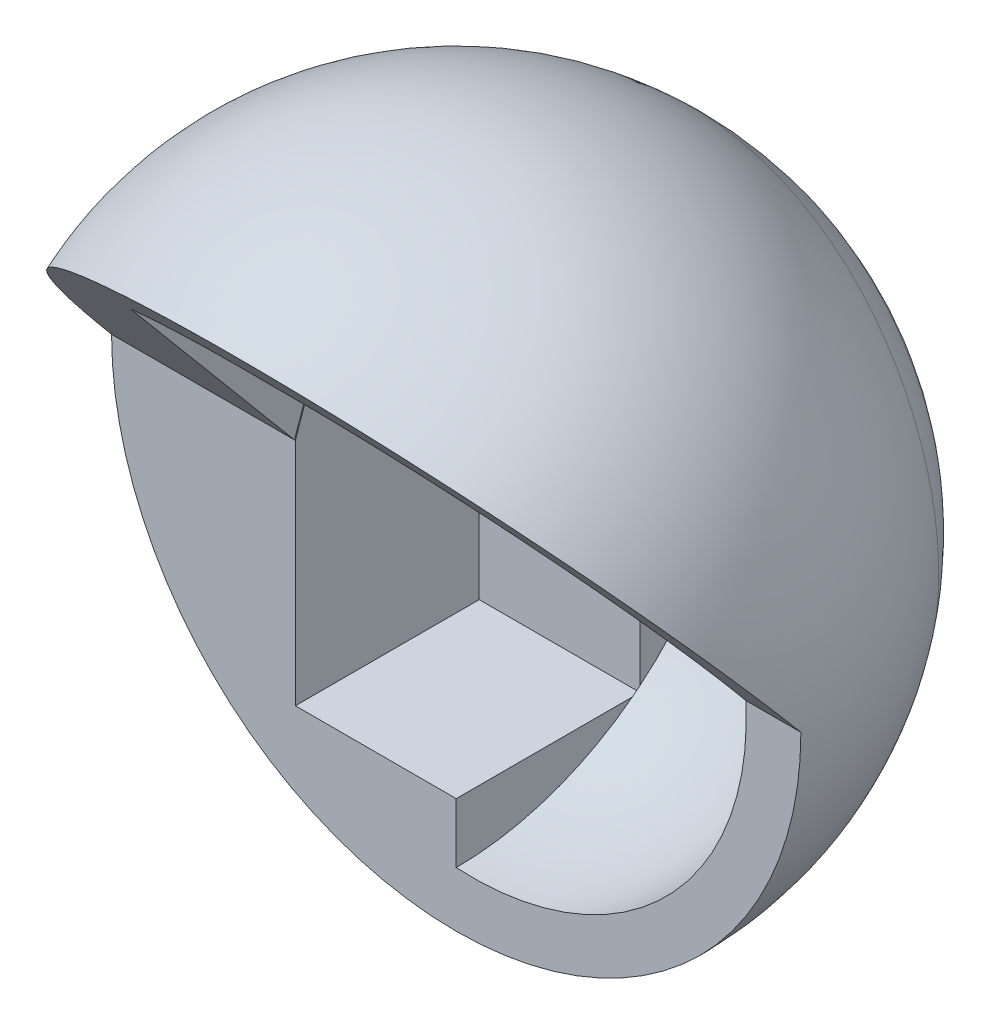
ISO-10303-21;
HEADER;
FILE_DESCRIPTION(('STEP AP214'),'2;1');
FILE_NAME('part.step','',(''),(''),'','','');
FILE_SCHEMA(('AUTOMOTIVE_DESIGN { 1 0 10303 214 1 1 1 1 }'));
ENDSEC;
DATA;
#1=APPLICATION_CONTEXT('core data for automotive mechanical design processes');
#2=APPLICATION_PROTOCOL_DEFINITION('international standard','automotive_design',2000,#1);
#3=PRODUCT_CONTEXT('',#1,'mechanical');
#4=PRODUCT('Part','Part','',(#3));
#5=PRODUCT_RELATED_PRODUCT_CATEGORY('part','',(#4));
#6=PRODUCT_DEFINITION_FORMATION('','',#4);
#7=PRODUCT_DEFINITION_CONTEXT('part definition',#1,'design');
#8=PRODUCT_DEFINITION('design','',#6,#7);
#9=PRODUCT_DEFINITION_SHAPE('','',#8);
#10=(LENGTH_UNIT() NAMED_UNIT(*) SI_UNIT(.MILLI.,.METRE.));
#11=(NAMED_UNIT(*) PLANE_ANGLE_UNIT() SI_UNIT($,.RADIAN.));
#12=(NAMED_UNIT(*) SI_UNIT($,.STERADIAN.) SOLID_ANGLE_UNIT());
#13=UNCERTAINTY_MEASURE_WITH_UNIT(LENGTH_MEASURE(1.E-05),#10,'distance_accuracy_value','');
#14=(GEOMETRIC_REPRESENTATION_CONTEXT(3) GLOBAL_UNCERTAINTY_ASSIGNED_CONTEXT((#13)) GLOBAL_UNIT_ASSIGNED_CONTEXT((#10,
#11,#12)) REPRESENTATION_CONTEXT('',''));
#15=CARTESIAN_POINT('',(0.,0.,0.));
#16=DIRECTION('',(0.,0.,1.));
#17=DIRECTION('',(1.,0.,0.));
#18=AXIS2_PLACEMENT_3D('',#15,#16,#17);
#19=CARTESIAN_POINT('',(0.,0.,0.));
#20=DIRECTION('',(-1.,0.,0.));
#21=DIRECTION('',(0.,-0.766044443118975,-0.642787609686545));
#22=AXIS2_PLACEMENT_3D('',#19,#20,#21);
#23=SPHERICAL_SURFACE('',#22,19.05);
#24=CARTESIAN_POINT('',(0.,0.,0.));
#25=DIRECTION('',(0.,0.642787609686547,-0.766044443118972));
#26=DIRECTION('',(1.,0.,0.));
#27=AXIS2_PLACEMENT_3D('',#24,#25,#26);
#28=CIRCLE('',#27,19.05);
#29=CARTESIAN_POINT('',(-19.05,0.,0.));
#30=VERTEX_POINT('',#29);
#31=CARTESIAN_POINT('',(19.0500000000001,0.,0.));
#32=VERTEX_POINT('',#31);
#33=EDGE_CURVE('E177',#30,#32,#28,.T.);
#34=ORIENTED_EDGE('',*,*,#33,.T.);
#35=CARTESIAN_POINT('',(0.,0.,0.));
#36=DIRECTION('',(0.,0.,0.999999999999999));
#37=DIRECTION('',(1.,0.,0.));
#38=AXIS2_PLACEMENT_3D('',#35,#36,#37);
#39=CIRCLE('',#38,19.05);
#40=EDGE_CURVE('E71',#30,#32,#39,.T.);
#41=ORIENTED_EDGE('',*,*,#40,.F.);
#42=EDGE_LOOP('',(#34,#41));
#43=FACE_BOUND('',#42,.T.);
#44=CARTESIAN_POINT('',(15.24,0.,-11.43));
#45=CARTESIAN_POINT('',(15.2400009823369,-0.178063826043721,-11.4299995298907));
#46=CARTESIAN_POINT('',(15.2362852653501,-0.356110612962425,-11.4307914957965));
#47=CARTESIAN_POINT('',(15.2214389171233,-0.711889701182731,-11.4339502030247));
#48=CARTESIAN_POINT('',(15.2103078202287,-0.889621982031875,-11.4363170432424));
#49=CARTESIAN_POINT('',(15.1662735878653,-1.41648921489206,-11.4456606275985));
#50=CARTESIAN_POINT('',(15.1227249297518,-1.76475595476199,-11.4548820073294));
#51=CARTESIAN_POINT('',(15.0073648564424,-2.45669954586842,-11.479088498572));
#52=CARTESIAN_POINT('',(14.9355234635593,-2.80037112762853,-11.4940797231636));
#53=CARTESIAN_POINT('',(14.7633034251424,-3.4846542732724,-11.5295636647649));
#54=CARTESIAN_POINT('',(14.6625888106055,-3.82517798952523,-11.5501209824876));
#55=CARTESIAN_POINT('',(14.4339890068772,-4.49680039201005,-11.5960198444238));
#56=CARTESIAN_POINT('',(14.3060916084978,-4.82789476700762,-11.6213635378732));
#57=CARTESIAN_POINT('',(14.0243586520837,-5.47863449923014,-11.6760835868837));
#58=CARTESIAN_POINT('',(13.8705141429511,-5.79827585915945,-11.7054613334391));
#59=CARTESIAN_POINT('',(13.5383894050791,-6.42410546764449,-11.7674038732233));
#60=CARTESIAN_POINT('',(13.3601181799638,-6.73029861851343,-11.7999674908893));
#61=CARTESIAN_POINT('',(12.9741946824925,-7.33790772737197,-11.868570274901));
#62=CARTESIAN_POINT('',(12.7657537276571,-7.6388134850875,-11.9046896589006));
#63=CARTESIAN_POINT('',(12.3263207118826,-8.22291593302925,-11.9784286539699));
#64=CARTESIAN_POINT('',(12.0953547359424,-8.50613249877752,-12.0160465005647));
#65=CARTESIAN_POINT('',(11.6124905851728,-9.05392019712117,-12.0918903574871));
#66=CARTESIAN_POINT('',(11.3605963077393,-9.31849478445508,-12.1301162535126));
#67=CARTESIAN_POINT('',(10.8373942729328,-9.82820375081322,-12.2063409556836));
#68=CARTESIAN_POINT('',(10.5660693447772,-10.0733205215544,-12.2443395280027));
#69=CARTESIAN_POINT('',(10.0033110780108,-10.5451803525052,-12.3196182782747));
#70=CARTESIAN_POINT('',(9.71170997024378,-10.7717248474113,-12.3568880835511));
#71=CARTESIAN_POINT('',(9.11247712461838,-11.2030596302656,-12.4295765170776));
#72=CARTESIAN_POINT('',(8.80483977802566,-11.4078422297787,-12.4649944888484));
#73=CARTESIAN_POINT('',(8.17541000621675,-11.7949000035578,-12.5332828541712));
#74=CARTESIAN_POINT('',(7.85361613128532,-11.977172865378,-12.5661529858523));
#75=CARTESIAN_POINT('',(7.19769453470059,-12.3186175387298,-12.6287396688006));
#76=CARTESIAN_POINT('',(6.86356599783701,-12.4777878199474,-12.6584560111259));
#77=CARTESIAN_POINT('',(6.13271408442844,-12.7951362452119,-12.7184870131802));
#78=CARTESIAN_POINT('',(5.73424548336606,-12.9494238430734,-12.7481954091645));
#79=CARTESIAN_POINT('',(4.92633051876324,-13.2259044533324,-12.8020356651709));
#80=CARTESIAN_POINT('',(4.51689293408801,-13.3481223336328,-12.8261718443156));
#81=CARTESIAN_POINT('',(3.68933910641374,-13.5601925264528,-12.8683868615838));
#82=CARTESIAN_POINT('',(3.27122135142691,-13.6500391493777,-12.8864646348388));
#83=CARTESIAN_POINT('',(2.42897149108955,-13.7970213071646,-12.9161839474554));
#84=CARTESIAN_POINT('',(2.00483824037518,-13.8541505244962,-12.9278242437649));
#85=CARTESIAN_POINT('',(1.15335913799094,-13.9354607073557,-12.9444253087144));
#86=CARTESIAN_POINT('',(0.726013758307721,-13.9596464219481,-12.9493870401207));
#87=CARTESIAN_POINT('',(-0.129294355563367,-13.9749987143737,-12.9525342605061));
#88=CARTESIAN_POINT('',(-0.557257090047398,-13.9661652763615,-12.9507197462333));
#89=CARTESIAN_POINT('',(-1.41114947893938,-13.915510412197,-12.9403508453284));
#90=CARTESIAN_POINT('',(-1.83707911280677,-13.8736886534684,-12.9317963907466));
#91=CARTESIAN_POINT('',(-2.68424729188399,-13.7572055031299,-12.9081203205957));
#92=CARTESIAN_POINT('',(-3.10548578684625,-13.6825437601118,-12.8929986347531));
#93=CARTESIAN_POINT('',(-3.94063238804488,-13.5006435553856,-12.8564973998677));
#94=CARTESIAN_POINT('',(-4.35453993382929,-13.3934026142734,-12.8351173745452));
#95=CARTESIAN_POINT('',(-5.17231107528757,-13.1467413362726,-12.7865505831501));
#96=CARTESIAN_POINT('',(-5.57617468216923,-13.0073210352939,-12.7593638235575));
#97=CARTESIAN_POINT('',(-6.37122230085516,-12.696805139293,-12.6997721188754));
#98=CARTESIAN_POINT('',(-6.76240429180942,-12.5257045247985,-12.6673663469848));
#99=CARTESIAN_POINT('',(-7.52929850043395,-12.1525153747465,-12.5980783134188));
#100=CARTESIAN_POINT('',(-7.90501075764324,-11.9504269183969,-12.5611960631858));
#101=CARTESIAN_POINT('',(-8.63375295787871,-11.5187411628049,-12.4843119423237));
#102=CARTESIAN_POINT('',(-8.98700304226822,-11.2895079642804,-12.4443534241266));
#103=CARTESIAN_POINT('',(-9.67303247475743,-10.8026051355471,-12.3619283062903));
#104=CARTESIAN_POINT('',(-10.0058124523812,-10.5449363805081,-12.3194617838596));
#105=CARTESIAN_POINT('',(-10.6356161217906,-10.0129791398455,-12.2348414695237));
#106=CARTESIAN_POINT('',(-10.9335294232034,-9.73973553269507,-12.1927404647835));
#107=CARTESIAN_POINT('',(-11.505527242837,-9.16937005036456,-12.1083801264602));
#108=CARTESIAN_POINT('',(-11.7796133144319,-8.8722497342182,-12.0661208033861));
#109=CARTESIAN_POINT('',(-12.2900511796257,-8.26922088329391,-11.9844832289104));
#110=CARTESIAN_POINT('',(-12.5275329024099,-7.96427490097515,-11.9450600399057));
#111=CARTESIAN_POINT('',(-12.9764149395347,-7.33552184385266,-11.8682737053425));
#112=CARTESIAN_POINT('',(-13.1878178790104,-7.01171667228576,-11.8309103526472));
#113=CARTESIAN_POINT('',(-13.5739199791342,-6.36157068044131,-11.7609284386558));
#114=CARTESIAN_POINT('',(-13.7498178142956,-6.03595639030059,-11.7281740096791));
#115=CARTESIAN_POINT('',(-14.0742041093614,-5.37108294653448,-11.6665531223031));
#116=CARTESIAN_POINT('',(-14.2227003641278,-5.03182770686564,-11.63768555885));
#117=CARTESIAN_POINT('',(-14.485857534727,-4.35446836864838,-11.5857150621979));
#118=CARTESIAN_POINT('',(-14.6015653973507,-4.01678437066805,-11.5624386225274));
#119=CARTESIAN_POINT('',(-14.8051104082635,-3.33244839246497,-11.5210229019137));
#120=CARTESIAN_POINT('',(-14.8929214595075,-2.98578834115906,-11.5028884329005));
#121=CARTESIAN_POINT('',(-15.0388821888958,-2.28943071045499,-11.4725159289446));
#122=CARTESIAN_POINT('',(-15.0973032087156,-1.9397924115333,-11.4602240136049));
#123=CARTESIAN_POINT('',(-15.1850896840794,-1.23657077522387,-11.4416841520356));
#124=CARTESIAN_POINT('',(-15.2144428773943,-0.882985836501701,-11.4354387565481));
#125=CARTESIAN_POINT('',(-15.2437156056609,-0.174555863389928,-11.4292105382512));
#126=CARTESIAN_POINT('',(-15.2436361940252,0.18028912544708,-11.4292274913083));
#127=CARTESIAN_POINT('',(-15.2140534716006,0.888538021719922,-11.4355215518692));
#128=CARTESIAN_POINT('',(-15.1845630651871,1.2419424929156,-11.4417959138707));
#129=CARTESIAN_POINT('',(-15.0972231464346,1.93928206392608,-11.4602403822743));
#130=CARTESIAN_POINT('',(-15.039837653679,2.28327802807118,-11.4723139837211));
#131=CARTESIAN_POINT('',(-14.8976204245087,2.96490914682813,-11.5019136494064));
#132=CARTESIAN_POINT('',(-14.8128187161898,3.30255083487449,-11.5194337474696));
#133=CARTESIAN_POINT('',(-14.616636467233,3.969659245162,-11.5593904894896));
#134=CARTESIAN_POINT('',(-14.5052597026754,4.29912712149363,-11.581826434911));
#135=CARTESIAN_POINT('',(-14.2568937081614,4.94826015487192,-11.630979510001));
#136=CARTESIAN_POINT('',(-14.1198815396053,5.26791623176717,-11.6577004708235));
#137=CARTESIAN_POINT('',(-13.8199739465631,5.89868260040762,-11.714966464938));
#138=CARTESIAN_POINT('',(-13.6568186141091,6.20966576268315,-11.7455491642992));
#139=CARTESIAN_POINT('',(-13.307041759511,6.817990899528,-11.8095011577134));
#140=CARTESIAN_POINT('',(-13.1204108804009,7.11532736989161,-11.842871561108));
#141=CARTESIAN_POINT('',(-12.7251899398673,7.69487779878962,-11.911554155097));
#142=CARTESIAN_POINT('',(-12.516594889756,7.97708829972692,-11.9468667859527));
#143=CARTESIAN_POINT('',(-12.0790237683722,8.52509991419247,-12.0185943400883));
#144=CARTESIAN_POINT('',(-11.8500461607787,8.79089978821965,-12.0550093463222));
#145=CARTESIAN_POINT('',(-11.3505325077107,9.32955718835129,-12.1316257288237));
#146=CARTESIAN_POINT('',(-11.0781157852458,9.60066818797933,-12.1718568524495));
#147=CARTESIAN_POINT('',(-10.5131229497405,10.120426344149,-12.2516326706488));
#148=CARTESIAN_POINT('',(-10.2205689226721,10.3690974412873,-12.2911780595269));
#149=CARTESIAN_POINT('',(-9.6171607192692,10.8432680565219,-12.368709057959));
#150=CARTESIAN_POINT('',(-9.30631008891412,11.068772041422,-12.406694967342));
#151=CARTESIAN_POINT('',(-8.66801570097351,11.4960167033466,-12.4803281861017));
#152=CARTESIAN_POINT('',(-8.34055682533806,11.6977351529541,-12.5159732944509));
#153=CARTESIAN_POINT('',(-7.66797034527362,12.0783695500258,-12.5845031571519));
#154=CARTESIAN_POINT('',(-7.32269786392683,12.2570350357093,-12.6173564502574));
#155=CARTESIAN_POINT('',(-6.61952420970179,12.5886031468368,-12.6792580855895));
#156=CARTESIAN_POINT('',(-6.26161851735144,12.7414964370784,-12.708305048243));
#157=CARTESIAN_POINT('',(-5.53527715873362,13.0209738364898,-12.7620380553652));
#158=CARTESIAN_POINT('',(-5.16683929705066,13.1475524142313,-12.7867231828003));
#159=CARTESIAN_POINT('',(-4.42167944429324,13.3739241700869,-12.8312702620071));
#160=CARTESIAN_POINT('',(-4.04496003127321,13.4737255597082,-12.8511336922248));
#161=CARTESIAN_POINT('',(-3.23576548018932,13.6575020488001,-12.8879432443825));
#162=CARTESIAN_POINT('',(-2.80240376410732,13.7377379342784,-12.9041753620186));
#163=CARTESIAN_POINT('',(-1.93081908676644,13.8633222287515,-12.9296799330743));
#164=CARTESIAN_POINT('',(-1.49260023500009,13.9086981403019,-12.9389578728075));
#165=CARTESIAN_POINT('',(-0.613734149021741,13.9645073839134,-12.9503791074339));
#166=CARTESIAN_POINT('',(-0.173086313089712,13.9749316284054,-12.9525205468085));
#167=CARTESIAN_POINT('',(0.707708186890407,13.9607701052577,-12.9496173593242));
#168=CARTESIAN_POINT('',(1.14785473648694,13.936177511965,-12.9445713314491));
#169=CARTESIAN_POINT('',(2.02463582285047,13.8520656732101,-12.9273989130698));
#170=CARTESIAN_POINT('',(2.46127055949343,13.7925484299609,-12.9152729284562));
#171=CARTESIAN_POINT('',(3.32814079266311,13.6388163054599,-12.8842027435452));
#172=CARTESIAN_POINT('',(3.75837637930125,13.5446019132879,-12.8652586393539));
#173=CARTESIAN_POINT('',(4.60958385011078,13.3218275513639,-12.8209674248702));
#174=CARTESIAN_POINT('',(5.03055467684063,13.1932636828833,-12.7956195877602));
#175=CARTESIAN_POINT('',(5.86024939335907,12.9023025634535,-12.7390981312105));
#176=CARTESIAN_POINT('',(6.26897323133379,12.7399051693866,-12.7079244871273));
#177=CARTESIAN_POINT('',(7.06354147666387,12.385366718088,-12.6411353491486));
#178=CARTESIAN_POINT('',(7.44967371722571,12.1938527253067,-12.6056160225868));
#179=CARTESIAN_POINT('',(8.20446464017783,11.7797120890807,-12.5305360771179));
#180=CARTESIAN_POINT('',(8.57312418408494,11.5570869817566,-12.4909756577671));
#181=CARTESIAN_POINT('',(9.27823048565961,11.0895846320235,-12.4101810545998));
#182=CARTESIAN_POINT('',(9.61534001286072,10.8456899049718,-12.3690458542122));
#183=CARTESIAN_POINT('',(10.2679768711361,10.3307804743298,-12.2849763726864));
#184=CARTESIAN_POINT('',(10.5835037396993,10.0597651898589,-12.2420420530252));
#185=CARTESIAN_POINT('',(11.1779550051695,9.50349128235924,-12.1573062558882));
#186=CARTESIAN_POINT('',(11.4578468891608,9.21926274108075,-12.1155298859807));
#187=CARTESIAN_POINT('',(11.992924210939,8.62849231470584,-12.0325336867134));
#188=CARTESIAN_POINT('',(12.2481179512218,8.32195798902232,-11.9913136743668));
#189=CARTESIAN_POINT('',(12.7206831221445,7.70240664831364,-11.9124315441053));
#190=CARTESIAN_POINT('',(12.9392406970778,7.39030417149601,-11.8746928009118));
#191=CARTESIAN_POINT('',(13.3500725990208,6.74844066386089,-11.801833571059));
#192=CARTESIAN_POINT('',(13.5423176099219,6.41866049746046,-11.7667160242844));
#193=CARTESIAN_POINT('',(13.893261513289,5.75333137486412,-11.7011712013867));
#194=CARTESIAN_POINT('',(14.0527607699283,5.41821518361871,-11.6706387231244));
#195=CARTESIAN_POINT('',(14.3433567558089,4.7353282751059,-11.6140357370345));
#196=CARTESIAN_POINT('',(14.4744413105113,4.38755220783925,-11.5879671427996));
#197=CARTESIAN_POINT('',(14.7066363220499,3.68198416936008,-11.5411766132903));
#198=CARTESIAN_POINT('',(14.8077630394081,3.324197747421,-11.5204517783238));
#199=CARTESIAN_POINT('',(14.9789277856846,2.6011464905636,-11.4850550723876));
#200=CARTESIAN_POINT('',(15.0489830165728,2.2358859110066,-11.4703798525146));
#201=CARTESIAN_POINT('',(15.1486338330844,1.55898700893214,-11.4494009601334));
#202=CARTESIAN_POINT('',(15.1828907766874,1.24805463354593,-11.4421373501742));
#203=CARTESIAN_POINT('',(15.2285610028948,0.624729443239556,-11.4324398185748));
#204=CARTESIAN_POINT('',(15.2399982769007,0.312338508605951,-11.4300008246101));
#205=CARTESIAN_POINT('',(15.24,0.,-11.43));
#206=B_SPLINE_CURVE_WITH_KNOTS('',3,(#44,#45,#46,#47,#48,#49,#50,#51,#52,#53,#54,#55,#56,#57,
#58,#59,#60,#61,#62,#63,#64,#65,#66,#67,#68,#69,#70,#71,#72,#73,#74,#75,#76,#77,#78,#79,#80,#81,
#82,#83,#84,#85,#86,#87,#88,#89,#90,#91,#92,#93,#94,#95,#96,#97,#98,#99,#100,#101,#102,#103,
#104,#105,#106,#107,#108,#109,#110,#111,#112,#113,#114,#115,#116,#117,#118,#119,#120,#121,#122,
#123,#124,#125,#126,#127,#128,#129,#130,#131,#132,#133,#134,#135,#136,#137,#138,#139,#140,#141,
#142,#143,#144,#145,#146,#147,#148,#149,#150,#151,#152,#153,#154,#155,#156,#157,#158,#159,#160,
#161,#162,#163,#164,#165,#166,#167,#168,#169,#170,#171,#172,#173,#174,#175,#176,#177,#178,#179,
#180,#181,#182,#183,#184,#185,#186,#187,#188,#189,#190,#191,#192,#193,#194,#195,#196,#197,#198,
#199,#200,#201,#202,#203,#204,#205),.UNSPECIFIED.,.T.,.F.,(4,2,2,2,2,2,2,2,2,2,2,2,2,2,2,2,2,2,
2,2,2,2,2,2,2,2,2,2,2,2,2,2,2,2,2,2,2,2,2,2,2,2,2,2,2,2,2,2,2,2,2,2,2,2,2,2,2,2,2,2,2,2,2,2,2,2,
2,2,2,2,2,2,2,2,2,2,2,2,2,2,4),(0.,0.534115971263528,1.06826548591724,2.12023334155935,
3.1733188260492,4.23919327706735,5.30554748274364,6.37227030895206,7.43860099634696,
8.54092859423999,9.6419944716687,10.7428557595262,11.8447021726132,12.9571066251537,
14.0699027904872,15.1828131794518,16.2957972539373,17.5793527912264,18.8619100566154,
20.1446926353183,21.4277228280278,22.7105680422861,23.9934138721712,25.2762726354156,
26.5591451263802,27.8421152734188,29.1250839887585,30.4082561536335,31.6914250386515,
32.9590020176743,34.2265399949686,35.4444786211775,36.6623377863947,37.8265886349648,
38.9907221922527,40.1040830655596,41.2171267338623,42.2890690767121,43.3620112725508,
44.4248569422601,45.4881507814343,46.5514065646123,47.614196038566,48.6598820803411,
49.7044266741287,50.7488229356608,51.7941582330597,52.8506168637206,53.9074979236862,
54.9646195513125,56.021820926316,57.1798972136866,58.3367229972802,59.4933253153889,
60.6510000453199,61.8203491633241,62.9901209369042,64.1601383518084,65.3297965573704,
66.6513745737911,67.9719088658103,69.2927864752573,70.6139215918674,71.9349809758495,
73.2560217393171,74.5772125070826,75.8984088636789,77.1943807976276,78.4902887651683,
79.7432300542143,80.9961981850768,82.1981206988791,83.3996377622946,84.5470130638351,
85.6956564832317,86.8115406369793,87.9279019605805,89.0436562304088,90.1587920167255,
91.0966616448383,92.0335447254372),.UNSPECIFIED.);
#207=CARTESIAN_POINT('',(15.24,0.,-11.43));
#208=VERTEX_POINT('',#207);
#209=EDGE_CURVE('E11',#208,#208,#206,.T.);
#210=ORIENTED_EDGE('',*,*,#209,.F.);
#211=EDGE_LOOP('',(#210));
#212=FACE_BOUND('',#211,.T.);
#213=ADVANCED_FACE('F46',(#43,#212),#23,.T.);
#214=ORIENTED_EDGE('',*,*,#209,.T.);
#215=EDGE_LOOP('',(#214));
#216=FACE_BOUND('',#215,.T.);
#217=CARTESIAN_POINT('',(12.7,0.,-14.1990316571235));
#218=CARTESIAN_POINT('',(12.7000011919336,-0.144173976678093,-14.1990312337091));
#219=CARTESIAN_POINT('',(12.6969685935169,-0.288330158540978,-14.1995470246628));
#220=CARTESIAN_POINT('',(12.6848532418367,-0.57638219702837,-14.2016042347578));
#221=CARTESIAN_POINT('',(12.6757704371854,-0.720278051431361,-14.2031456626103));
#222=CARTESIAN_POINT('',(12.6398392461138,-1.14685591139984,-14.2092323305751));
#223=CARTESIAN_POINT('',(12.6043043260191,-1.4288344666971,-14.2152409324915));
#224=CARTESIAN_POINT('',(12.5101858595893,-1.98907866334224,-14.2310286420309));
#225=CARTESIAN_POINT('',(12.4515776337896,-2.26733999811314,-14.2408117867223));
#226=CARTESIAN_POINT('',(12.3111133272865,-2.82137416789168,-14.2639972118201));
#227=CARTESIAN_POINT('',(12.2289844117979,-3.09707610255316,-14.2774418694805));
#228=CARTESIAN_POINT('',(12.0426253825513,-3.64085058138803,-14.3075070027316));
#229=CARTESIAN_POINT('',(11.9383853762238,-3.90891964950084,-14.3241288994986));
#230=CARTESIAN_POINT('',(11.7088490926334,-4.43579871667571,-14.3600823912753));
#231=CARTESIAN_POINT('',(11.5835453702344,-4.69460540250698,-14.3794149439855));
#232=CARTESIAN_POINT('',(11.3131541397678,-5.20134997125156,-14.4202589916366));
#233=CARTESIAN_POINT('',(11.1680738214409,-5.44929176098533,-14.4417696939883));
#234=CARTESIAN_POINT('',(10.853951256023,-5.94168401820501,-14.4872154974529));
#235=CARTESIAN_POINT('',(10.6842465183311,-6.18570621968648,-14.5112092046636));
#236=CARTESIAN_POINT('',(10.3266586438838,-6.65946836622561,-14.5603121559949));
#237=CARTESIAN_POINT('',(10.1387962754997,-6.88922414610075,-14.5854201082856));
#238=CARTESIAN_POINT('',(9.74627251994209,-7.33373868142113,-14.6361706665364));
#239=CARTESIAN_POINT('',(9.54161469519531,-7.5485005993695,-14.6618131582607));
#240=CARTESIAN_POINT('',(9.11678670891101,-7.96244670463671,-14.713083792078));
#241=CARTESIAN_POINT('',(8.89660365660609,-8.16161765007049,-14.7387119040058));
#242=CARTESIAN_POINT('',(8.44031917542324,-8.54523132813597,-14.7896187480501));
#243=CARTESIAN_POINT('',(8.20409247733146,-8.72952562106787,-14.814892270805));
#244=CARTESIAN_POINT('',(7.7189269569877,-9.08086842869944,-14.8643482164419));
#245=CARTESIAN_POINT('',(7.46998384835399,-9.24791107020057,-14.8885302661729));
#246=CARTESIAN_POINT('',(6.96087241743253,-9.56425025765011,-14.9353355733314));
#247=CARTESIAN_POINT('',(6.70070211914897,-9.713543662211,-14.957958554527));
#248=CARTESIAN_POINT('',(6.17059379110908,-9.99398511971295,-15.0012312026079));
#249=CARTESIAN_POINT('',(5.90065499606313,-10.1251317470887,-15.0218807144232));
#250=CARTESIAN_POINT('',(5.30176810505085,-10.3914909366883,-15.0644447833328));
#251=CARTESIAN_POINT('',(4.97112607302463,-10.5229844930597,-15.0858891232812));
#252=CARTESIAN_POINT('',(4.30062176336839,-10.7595835053229,-15.1249862611916));
#253=CARTESIAN_POINT('',(3.96076665489529,-10.8647088615385,-15.1426419170457));
#254=CARTESIAN_POINT('',(3.27373677009155,-11.048433034533,-15.1737921152871));
#255=CARTESIAN_POINT('',(2.926561183303,-11.1270288976465,-15.1872861943302));
#256=CARTESIAN_POINT('',(2.22701850285732,-11.2574858235528,-15.2098208575028));
#257=CARTESIAN_POINT('',(1.87465044024578,-11.3093418298087,-15.2188605992979));
#258=CARTESIAN_POINT('',(1.16702279937401,-11.3861568730666,-15.2322898312531));
#259=CARTESIAN_POINT('',(0.811764173816176,-11.4111244370857,-15.2366807956527));
#260=CARTESIAN_POINT('',(0.100245370899986,-11.4341348800506,-15.2407266619263));
#261=CARTESIAN_POINT('',(-0.256015070233497,-11.4321698400964,-15.2403801708627));
#262=CARTESIAN_POINT('',(-0.967283220201629,-11.401302704591,-15.2349553128698));
#263=CARTESIAN_POINT('',(-1.32229109385298,-11.3724042966323,-15.2298775937184));
#264=CARTESIAN_POINT('',(-2.02899796061208,-11.2877452605853,-15.2150970937302));
#265=CARTESIAN_POINT('',(-2.38069693083425,-11.2319844468457,-15.2053942809283));
#266=CARTESIAN_POINT('',(-3.07874781945045,-11.0937208063314,-15.1815658825203));
#267=CARTESIAN_POINT('',(-3.42509831366125,-11.0112109812577,-15.1674391395217));
#268=CARTESIAN_POINT('',(-4.11008689563207,-10.819698228841,-15.1350753920738));
#269=CARTESIAN_POINT('',(-4.44872743061052,-10.710703839891,-15.1168397124475));
#270=CARTESIAN_POINT('',(-5.11633313586231,-10.4664628559894,-15.0766567248867));
#271=CARTESIAN_POINT('',(-5.44529465273934,-10.3312064910606,-15.0547080360315));
#272=CARTESIAN_POINT('',(-6.09114745346901,-10.0348708892179,-15.0076171513311));
#273=CARTESIAN_POINT('',(-6.40803888501949,-9.87379196841215,-14.9824749945798));
#274=CARTESIAN_POINT('',(-7.02473958229386,-9.52784669565534,-14.9298450307636));
#275=CARTESIAN_POINT('',(-7.32467317970368,-9.34319880285667,-14.902379462325));
#276=CARTESIAN_POINT('',(-7.90807566277564,-8.94969390956109,-14.845619443708));
#277=CARTESIAN_POINT('',(-8.19154407368624,-8.74083621152658,-14.8163249408452));
#278=CARTESIAN_POINT('',(-8.72619380703079,-8.31055312055369,-14.7581668251614));
#279=CARTESIAN_POINT('',(-8.97827597184738,-8.09024052963232,-14.7293521040248));
#280=CARTESIAN_POINT('',(-9.46315898530818,-7.62947690320634,-14.6715655785667));
#281=CARTESIAN_POINT('',(-9.69596672549297,-7.3890331279617,-14.6425938343707));
#282=CARTESIAN_POINT('',(-10.1286955803559,-6.90208001460157,-14.5867946681653));
#283=CARTESIAN_POINT('',(-10.3296967497074,-6.65653432376014,-14.5599340273471));
#284=CARTESIAN_POINT('',(-10.7109098997355,-6.14919979280102,-14.5075055857422));
#285=CARTESIAN_POINT('',(-10.8910979878664,-5.8873928050596,-14.4819392893454));
#286=CARTESIAN_POINT('',(-11.2227147675241,-5.35862592192972,-14.4337393518864));
#287=CARTESIAN_POINT('',(-11.374927528739,-5.09216451155132,-14.4110345126785));
#288=CARTESIAN_POINT('',(-11.65656469941,-4.54709875176604,-14.3682109516872));
#289=CARTESIAN_POINT('',(-11.7859797992567,-4.26848949935824,-14.3480932872987));
#290=CARTESIAN_POINT('',(-12.0204285753302,-3.70120845582816,-14.3110908401995));
#291=CARTESIAN_POINT('',(-12.1254797783053,-3.41254407112384,-14.2942037350506));
#292=CARTESIAN_POINT('',(-12.310031952808,-2.8271090321331,-14.2642012560839));
#293=CARTESIAN_POINT('',(-12.3895455897479,-2.53034247562208,-14.2510840129352));
#294=CARTESIAN_POINT('',(-12.5198916320476,-1.94077059311727,-14.229421409082));
#295=CARTESIAN_POINT('',(-12.5715898011648,-1.64816166373987,-14.2207385320394));
#296=CARTESIAN_POINT('',(-12.6496139995108,-1.05945940713032,-14.2075865501877));
#297=CARTESIAN_POINT('',(-12.6759387657113,-0.763365907186939,-14.2031176551411));
#298=CARTESIAN_POINT('',(-12.7023560766934,-0.181554938628197,-14.1986324472332));
#299=CARTESIAN_POINT('',(-12.7034311953077,0.104117069843303,-14.1984493560203));
#300=CARTESIAN_POINT('',(-12.6818254362356,0.67465380041476,-14.20211862606));
#301=CARTESIAN_POINT('',(-12.6591348731376,0.959518145903663,-14.2059726325822));
#302=CARTESIAN_POINT('',(-12.5902352818768,1.52638983663644,-14.217601531946));
#303=CARTESIAN_POINT('',(-12.5440190759495,1.80839628312619,-14.2253776214236));
#304=CARTESIAN_POINT('',(-12.4286131053172,2.36741381580984,-14.2446109978016));
#305=CARTESIAN_POINT('',(-12.3594326762726,2.64442688379626,-14.2560667887295));
#306=CARTESIAN_POINT('',(-12.1994226227306,3.18981097376227,-14.2822285199189));
#307=CARTESIAN_POINT('',(-12.1087507385191,3.45822950296945,-14.2969107246569));
#308=CARTESIAN_POINT('',(-11.9065444216441,3.98654952480696,-14.3291414603467));
#309=CARTESIAN_POINT('',(-11.7950337996215,4.24646034406112,-14.3466867170615));
#310=CARTESIAN_POINT('',(-11.5521745786932,4.75659288036861,-14.3841833285792));
#311=CARTESIAN_POINT('',(-11.4208294066328,5.00681626177093,-14.4041342676289));
#312=CARTESIAN_POINT('',(-11.1393439730951,5.49655688657198,-14.4459563673077));
#313=CARTESIAN_POINT('',(-10.9891879807459,5.73606493888635,-14.4678291304691));
#314=CARTESIAN_POINT('',(-10.6698962973564,6.20527929613068,-14.5131710836254));
#315=CARTESIAN_POINT('',(-10.5005931747067,6.43487026653421,-14.5366535151416));
#316=CARTESIAN_POINT('',(-10.1454459730516,6.88090476521283,-14.5844934888639));
#317=CARTESIAN_POINT('',(-9.95959586877758,7.09734345566966,-14.6088513478993));
#318=CARTESIAN_POINT('',(-9.57268686768986,7.51622709360891,-14.6579128550166));
#319=CARTESIAN_POINT('',(-9.37162380461974,7.7186681784119,-14.682616596302));
#320=CARTESIAN_POINT('',(-8.9556542367924,8.10882096144432,-14.7318605726962));
#321=CARTESIAN_POINT('',(-8.74074654869614,8.2965313975541,-14.75640079363));
#322=CARTESIAN_POINT('',(-8.2653178554742,8.68357942738959,-14.8084674788893));
#323=CARTESIAN_POINT('',(-8.00278109018934,8.880459452129,-14.8358918621459));
#324=CARTESIAN_POINT('',(-7.46339352136657,9.25308760312908,-14.8892139267222));
#325=CARTESIAN_POINT('',(-7.18655741308294,9.42885683023027,-14.9151131190875));
#326=CARTESIAN_POINT('',(-6.62027962517529,9.75890784717156,-14.9648289439635));
#327=CARTESIAN_POINT('',(-6.33084095283289,9.91319472673905,-14.9886460692707));
#328=CARTESIAN_POINT('',(-5.74087554499753,10.2000164869243,-15.0337188536629));
#329=CARTESIAN_POINT('',(-5.44033905921845,10.3325316543572,-15.0549721867871));
#330=CARTESIAN_POINT('',(-4.82720757115573,10.5764944487078,-15.0946567349742));
#331=CARTESIAN_POINT('',(-4.51452284982355,10.687721311639,-15.1130580365018));
#332=CARTESIAN_POINT('',(-3.88162323558294,10.8872278668108,-15.1464247561136));
#333=CARTESIAN_POINT('',(-3.56140570714684,10.9754993933601,-15.1613889513271));
#334=CARTESIAN_POINT('',(-2.9153033477446,11.1288421316144,-15.1875867408674));
#335=CARTESIAN_POINT('',(-2.58941831459206,11.193912513838,-15.1988202018131));
#336=CARTESIAN_POINT('',(-1.9337295901889,11.3007072374865,-15.2173468032152));
#337=CARTESIAN_POINT('',(-1.60392569346727,11.3424303492192,-15.2246397361247));
#338=CARTESIAN_POINT('',(-0.895435662370401,11.4066677279792,-15.2358907525053));
#339=CARTESIAN_POINT('',(-0.516413985304393,11.4256440355919,-15.2392336287734));
#340=CARTESIAN_POINT('',(0.241629411197591,11.4330182117327,-15.2405310317642));
#341=CARTESIAN_POINT('',(0.620650903043606,11.4214397623293,-15.2384897315999));
#342=CARTESIAN_POINT('',(1.37659236609766,11.3677797429953,-15.2290748851087));
#343=CARTESIAN_POINT('',(1.7535116074577,11.3256881722379,-15.2216995905405));
#344=CARTESIAN_POINT('',(2.50263971173645,11.2110949283275,-15.2017877741749));
#345=CARTESIAN_POINT('',(2.8748476688902,11.1385874963954,-15.1892502750011));
#346=CARTESIAN_POINT('',(3.60815358388978,10.9642601668352,-15.1594702030443));
#347=CARTESIAN_POINT('',(3.9693259290951,10.862744972154,-15.1422766319273));
#348=CARTESIAN_POINT('',(4.68188119319294,10.6304273952797,-15.1035521204356));
#349=CARTESIAN_POINT('',(5.03326465385657,10.4996266375474,-15.0820214206467));
#350=CARTESIAN_POINT('',(5.71246793134301,10.213856891252,-15.0359296700895));
#351=CARTESIAN_POINT('',(6.04068229049582,10.0598062062276,-15.0114891259712));
#352=CARTESIAN_POINT('',(6.68306354708055,9.72518043538286,-14.9596736051251));
#353=CARTESIAN_POINT('',(6.99723116229102,9.54460670689622,-14.9322987785803));
#354=CARTESIAN_POINT('',(7.59586404830879,9.16591123717329,-14.8765645432736));
#355=CARTESIAN_POINT('',(7.88102549344345,8.96887634172234,-14.8482979261609));
#356=CARTESIAN_POINT('',(8.43393085102276,8.55184229585453,-14.7904709062456));
#357=CARTESIAN_POINT('',(8.70167465501211,8.33184300246631,-14.7609104953889));
#358=CARTESIAN_POINT('',(9.2045597688012,7.88132903126936,-14.7027980117059));
#359=CARTESIAN_POINT('',(9.44066042038235,7.65188227959386,-14.6742689542574));
#360=CARTESIAN_POINT('',(9.89291344287558,7.17417810672552,-14.6175533707342));
#361=CARTESIAN_POINT('',(10.1090726318818,6.92592716804804,-14.5893667304688));
#362=CARTESIAN_POINT('',(10.5088481304829,6.42510109533823,-14.5355655137704));
#363=CARTESIAN_POINT('',(10.6935695752298,6.17341436031319,-14.5098933162085));
#364=CARTESIAN_POINT('',(11.0417715935784,5.65516564482443,-14.4602575191753));
#365=CARTESIAN_POINT('',(11.2052290232953,5.3885879004217,-14.4362957939791));
#366=CARTESIAN_POINT('',(11.5040015916899,4.85129903647625,-14.3915668664629));
#367=CARTESIAN_POINT('',(11.6400638586621,4.58101018138403,-14.3707206706755));
#368=CARTESIAN_POINT('',(11.8891628751315,4.02966611882982,-14.3319228134373));
#369=CARTESIAN_POINT('',(12.0021900538641,3.7486064936448,-14.3139723557692));
#370=CARTESIAN_POINT('',(12.2038365388831,3.1777853558966,-14.2815407983987));
#371=CARTESIAN_POINT('',(12.2924656615513,2.88802739524065,-14.2670583036925));
#372=CARTESIAN_POINT('',(12.4442792513139,2.30189509416334,-14.2420306983875));
#373=CARTESIAN_POINT('',(12.507476909815,2.00552426828558,-14.231483546717));
#374=CARTESIAN_POINT('',(12.6049051572081,1.42495344008044,-14.2151396738434));
#375=CARTESIAN_POINT('',(12.6405552133838,1.14099698297638,-14.2091107382932));
#376=CARTESIAN_POINT('',(12.6880875749242,0.571335445900162,-14.2010594890089));
#377=CARTESIAN_POINT('',(12.69999763858,0.285632800404952,-14.1990324959785));
#378=CARTESIAN_POINT('',(12.7,0.,-14.1990316571235));
#379=B_SPLINE_CURVE_WITH_KNOTS('',3,(#217,#218,#219,#220,#221,#222,#223,#224,#225,#226,#227,
#228,#229,#230,#231,#232,#233,#234,#235,#236,#237,#238,#239,#240,#241,#242,#243,#244,#245,#246,
#247,#248,#249,#250,#251,#252,#253,#254,#255,#256,#257,#258,#259,#260,#261,#262,#263,#264,#265,
#266,#267,#268,#269,#270,#271,#272,#273,#274,#275,#276,#277,#278,#279,#280,#281,#282,#283,#284,
#285,#286,#287,#288,#289,#290,#291,#292,#293,#294,#295,#296,#297,#298,#299,#300,#301,#302,#303,
#304,#305,#306,#307,#308,#309,#310,#311,#312,#313,#314,#315,#316,#317,#318,#319,#320,#321,#322,
#323,#324,#325,#326,#327,#328,#329,#330,#331,#332,#333,#334,#335,#336,#337,#338,#339,#340,#341,
#342,#343,#344,#345,#346,#347,#348,#349,#350,#351,#352,#353,#354,#355,#356,#357,#358,#359,#360,
#361,#362,#363,#364,#365,#366,#367,#368,#369,#370,#371,#372,#373,#374,#375,#376,#377,#378),
.UNSPECIFIED.,.T.,.F.,(4,2,2,2,2,2,2,2,2,2,2,2,2,2,2,2,2,2,2,2,2,2,2,2,2,2,2,2,2,2,2,2,2,2,2,2,
2,2,2,2,2,2,2,2,2,2,2,2,2,2,2,2,2,2,2,2,2,2,2,2,2,2,2,2,2,2,2,2,2,2,2,2,2,2,2,2,2,2,2,2,4),(0.,
0.432453847657271,0.864911368434075,1.71665051003622,2.56930316734829,3.43227747510199,
4.29563869764989,5.15930572614453,6.02265960352094,6.91632768744778,7.80898544092227,
8.70145434276712,9.59467320155808,10.4959189780205,11.3974705725562,12.2991814933804,
13.2009632101866,14.2692234448845,15.336675011321,16.4042453834834,17.4720175604302,
18.5394510195337,19.6071983391262,20.674799489158,21.7424080176902,22.8102960885741,
23.8778403373476,24.9457824973834,26.0137115851465,27.0723771476865,28.1310732202892,
29.1380369550791,30.1446390825146,31.0989601932596,32.0543661600487,32.9764380433229,
33.8988855936374,34.8206674867263,35.7419915115654,36.6326807208631,37.5234142642858,
38.3794255128653,39.2357857541053,40.0924074309067,40.9486812903617,41.7988550391189,
42.6480632417332,43.4971248928745,44.3469013865351,45.2047863943591,46.0629850723569,
46.9214196353132,47.7799276686858,48.7667914093165,49.7526603946494,50.7382954030419,
51.7248179935867,52.7210741523895,53.7176842169919,54.7143299085644,55.7110280881613,
56.8482611978279,57.9846131314209,59.1213376784831,60.2582775441976,61.3836881246475,
62.5090362943967,63.5979940970492,64.6868961909938,65.7290281669958,66.7711666314725,
67.7614499039528,68.7513933285516,69.6901140945932,70.629848170874,71.5387635445359,
72.4480557936671,73.3569816591284,74.265435451347,75.1232025148455,75.9799660334661),.UNSPECIFIED.);
#380=CARTESIAN_POINT('',(12.7,0.,-14.1990316571235));
#381=VERTEX_POINT('',#380);
#382=EDGE_CURVE('E56',#381,#381,#379,.T.);
#383=ORIENTED_EDGE('',*,*,#382,.F.);
#384=EDGE_LOOP('',(#383));
#385=FACE_BOUND('',#384,.T.);
#386=ADVANCED_FACE('F217',(#216,#385),#23,.T.);
#387=CARTESIAN_POINT('',(0.,0.,0.));
#388=DIRECTION('',(-1.,0.,0.));
#389=DIRECTION('',(0.,-1.,0.));
#390=AXIS2_PLACEMENT_3D('',#387,#388,#389);
#391=PLANE('',#390);
#392=DIRECTION('',(0.,0.945518575599321,-0.325568154457151));
#393=VECTOR('',#392,1.);
#394=CARTESIAN_POINT('',(0.,0.,0.));
#395=LINE('',#394,#393);
#396=CARTESIAN_POINT('',(0.,12.7,-4.37296068877865));
#397=VERTEX_POINT('',#396);
#398=CARTESIAN_POINT('',(1.66533453693773E-13,15.1301882467403,-5.20974160762347));
#399=VERTEX_POINT('',#398);
#400=EDGE_CURVE('E287',#397,#399,#395,.T.);
#401=ORIENTED_EDGE('',*,*,#400,.F.);
#402=DIRECTION('',(0.,0.,-0.999999999999999));
#403=VECTOR('',#402,1.);
#404=CARTESIAN_POINT('',(2.4980018054066E-13,12.7000000000001,0.));
#405=LINE('',#404,#403);
#406=CARTESIAN_POINT('',(0.,12.7000000000001,-9.7351940915423));
#407=VERTEX_POINT('',#406);
#408=EDGE_CURVE('E183',#397,#407,#405,.T.);
#409=ORIENTED_EDGE('',*,*,#408,.T.);
#410=CARTESIAN_POINT('',(0.,0.,0.));
#411=DIRECTION('',(1.,0.,0.));
#412=DIRECTION('',(0.,1.,0.));
#413=AXIS2_PLACEMENT_3D('',#410,#411,#412);
#414=CIRCLE('',#413,16.002);
#415=EDGE_CURVE('E158',#407,#399,#414,.T.);
#416=ORIENTED_EDGE('',*,*,#415,.T.);
#417=EDGE_LOOP('',(#401,#409,#416));
#418=FACE_BOUND('',#417,.T.);
#419=ADVANCED_FACE('F213',(#418),#391,.F.);
#420=CARTESIAN_POINT('',(-8.89000000000001,12.7000000000001,-10.16));
#421=DIRECTION('',(-1.,0.,0.));
#422=DIRECTION('',(0.,0.,0.999999999999999));
#423=AXIS2_PLACEMENT_3D('',#420,#421,#422);
#424=PLANE('',#423);
#425=DIRECTION('',(0.,0.945518575599321,-0.325568154457151));
#426=VECTOR('',#425,1.);
#427=CARTESIAN_POINT('',(-8.88999999999998,14.4814285800571,-4.98635573999567));
#428=LINE('',#427,#426);
#429=CARTESIAN_POINT('',(-8.88999999999987,0.,0.));
#430=VERTEX_POINT('',#429);
#431=CARTESIAN_POINT('',(-8.88999999999987,12.7000000000001,-4.37296068877868));
#432=VERTEX_POINT('',#431);
#433=EDGE_CURVE('E63',#430,#432,#428,.T.);
#434=ORIENTED_EDGE('',*,*,#433,.F.);
#435=DIRECTION('',(0.,-1.,0.));
#436=VECTOR('',#435,1.);
#437=CARTESIAN_POINT('',(-8.88999999999984,12.7000000000001,0.));
#438=LINE('',#437,#436);
#439=CARTESIAN_POINT('',(-8.88999999999987,-12.7,0.));
#440=VERTEX_POINT('',#439);
#441=EDGE_CURVE('E297',#430,#440,#438,.T.);
#442=ORIENTED_EDGE('',*,*,#441,.T.);
#443=DIRECTION('',(0.,0.,0.999999999999999));
#444=VECTOR('',#443,1.);
#445=CARTESIAN_POINT('',(-8.88999999999987,-12.7,-10.16));
#446=LINE('',#445,#444);
#447=CARTESIAN_POINT('',(-8.88999999999987,-12.7,-10.16));
#448=VERTEX_POINT('',#447);
#449=EDGE_CURVE('E165',#448,#440,#446,.T.);
#450=ORIENTED_EDGE('',*,*,#449,.F.);
#451=DIRECTION('',(0.,-1.,0.));
#452=VECTOR('',#451,1.);
#453=CARTESIAN_POINT('',(-8.89000000000001,12.7000000000001,-10.16));
#454=LINE('',#453,#452);
#455=CARTESIAN_POINT('',(-8.89000000000001,12.7000000000001,-10.16));
#456=VERTEX_POINT('',#455);
#457=EDGE_CURVE('E302',#456,#448,#454,.T.);
#458=ORIENTED_EDGE('',*,*,#457,.F.);
#459=DIRECTION('',(0.,0.,0.999999999999999));
#460=VECTOR('',#459,1.);
#461=CARTESIAN_POINT('',(-8.89000000000001,12.7000000000001,-10.16));
#462=LINE('',#461,#460);
#463=EDGE_CURVE('E284',#456,#432,#462,.T.);
#464=ORIENTED_EDGE('',*,*,#463,.T.);
#465=EDGE_LOOP('',(#434,#442,#450,#458,#464));
#466=FACE_BOUND('',#465,.T.);
#467=ADVANCED_FACE('F216',(#466),#424,.F.);
#468=CARTESIAN_POINT('',(0.,12.7000000000001,-10.1599999999999));
#469=DIRECTION('',(0.,1.,0.));
#470=DIRECTION('',(0.,0.,0.999999999999999));
#471=AXIS2_PLACEMENT_3D('',#468,#469,#470);
#472=PLANE('',#471);
#473=DIRECTION('',(1.,0.,0.));
#474=VECTOR('',#473,1.);
#475=CARTESIAN_POINT('',(0.,12.7,-4.37296068877865));
#476=LINE('',#475,#474);
#477=EDGE_CURVE('E191',#432,#397,#476,.T.);
#478=ORIENTED_EDGE('',*,*,#477,.F.);
#479=ORIENTED_EDGE('',*,*,#463,.F.);
#480=DIRECTION('',(-1.,0.,0.));
#481=VECTOR('',#480,1.);
#482=CARTESIAN_POINT('',(0.,12.7000000000001,-10.1599999999999));
#483=LINE('',#482,#481);
#484=CARTESIAN_POINT('',(0.,12.7000000000001,-10.1599999999999));
#485=VERTEX_POINT('',#484);
#486=EDGE_CURVE('E283',#485,#456,#483,.T.);
#487=ORIENTED_EDGE('',*,*,#486,.F.);
#488=DIRECTION('',(0.,0.,0.999999999999999));
#489=VECTOR('',#488,1.);
#490=CARTESIAN_POINT('',(0.,12.7000000000001,-10.1599999999999));
#491=LINE('',#490,#489);
#492=EDGE_CURVE('E168',#485,#407,#491,.T.);
#493=ORIENTED_EDGE('',*,*,#492,.T.);
#494=ORIENTED_EDGE('',*,*,#408,.F.);
#495=EDGE_LOOP('',(#478,#479,#487,#493,#494));
#496=FACE_BOUND('',#495,.T.);
#497=ADVANCED_FACE('F225',(#496),#472,.F.);
#498=CARTESIAN_POINT('',(0.,-16.002,0.));
#499=VERTEX_POINT('',#498);
#500=CARTESIAN_POINT('',(0.,-12.7,-9.73519409154217));
#501=VERTEX_POINT('',#500);
#502=EDGE_CURVE('E163',#499,#501,#414,.T.);
#503=ORIENTED_EDGE('',*,*,#502,.T.);
#504=DIRECTION('',(0.,0.,0.999999999999999));
#505=VECTOR('',#504,1.);
#506=CARTESIAN_POINT('',(0.,-12.7,0.));
#507=LINE('',#506,#505);
#508=CARTESIAN_POINT('',(0.,-12.7,0.));
#509=VERTEX_POINT('',#508);
#510=EDGE_CURVE('E188',#501,#509,#507,.T.);
#511=ORIENTED_EDGE('',*,*,#510,.T.);
#512=DIRECTION('',(0.,-1.,0.));
#513=VECTOR('',#512,1.);
#514=CARTESIAN_POINT('',(0.,0.,0.));
#515=LINE('',#514,#513);
#516=EDGE_CURVE('E180',#509,#499,#515,.T.);
#517=ORIENTED_EDGE('',*,*,#516,.T.);
#518=EDGE_LOOP('',(#503,#511,#517));
#519=FACE_BOUND('',#518,.T.);
#520=ADVANCED_FACE('F219',(#519),#391,.F.);
#521=CARTESIAN_POINT('',(1.38777878078145E-13,-12.3627830200162,-10.16));
#522=VERTEX_POINT('',#521);
#523=CARTESIAN_POINT('',(1.38777878078145E-13,12.3627830200162,-10.1599999999999));
#524=VERTEX_POINT('',#523);
#525=EDGE_CURVE('E271',#522,#524,#414,.T.);
#526=ORIENTED_EDGE('',*,*,#525,.T.);
#527=DIRECTION('',(0.,-1.,0.));
#528=VECTOR('',#527,1.);
#529=CARTESIAN_POINT('',(1.38777878078145E-13,0.,-10.16));
#530=LINE('',#529,#528);
#531=EDGE_CURVE('E185',#524,#522,#530,.T.);
#532=ORIENTED_EDGE('',*,*,#531,.T.);
#533=EDGE_LOOP('',(#526,#532));
#534=FACE_BOUND('',#533,.T.);
#535=ADVANCED_FACE('F220',(#534),#391,.F.);
#536=ORIENTED_EDGE('',*,*,#382,.T.);
#537=EDGE_LOOP('',(#536));
#538=FACE_BOUND('',#537,.T.);
#539=ADVANCED_FACE('F201',(#538),#23,.T.);
#540=CARTESIAN_POINT('',(0.,0.,0.));
#541=DIRECTION('',(0.,0.642787609686547,-0.766044443118972));
#542=DIRECTION('',(1.,0.,0.));
#543=AXIS2_PLACEMENT_3D('',#540,#541,#542);
#544=PLANE('',#543);
#545=DIRECTION('',(0.,-0.766044443118975,-0.642787609686545));
#546=VECTOR('',#545,1.);
#547=CARTESIAN_POINT('',(-8.93894812968909,0.,0.));
#548=LINE('',#547,#546);
#549=CARTESIAN_POINT('',(-8.93894812968909,10.7943754104985,9.05755642573852));
#550=VERTEX_POINT('',#549);
#551=CARTESIAN_POINT('',(-8.93894812968909,0.,0.));
#552=VERTEX_POINT('',#551);
#553=EDGE_CURVE('E152',#550,#552,#548,.T.);
#554=ORIENTED_EDGE('',*,*,#553,.F.);
#555=CARTESIAN_POINT('',(-1.44664264071453,0.694364695782934,0.582641160133984));
#556=DIRECTION('',(0.,-0.642787609686547,0.766044443118972));
#557=DIRECTION('',(0.,-0.766044443118975,-0.642787609686545));
#558=AXIS2_PLACEMENT_3D('',#555,#556,#557);
#559=CIRCLE('',#558,15.1647303548947);
#560=CARTESIAN_POINT('',(2.77555756156289E-13,12.2582431787898,10.2858873302041));
#561=VERTEX_POINT('',#560);
#562=EDGE_CURVE('E136',#561,#550,#559,.T.);
#563=ORIENTED_EDGE('',*,*,#562,.F.);
#564=CARTESIAN_POINT('',(0.890794690740437,0.682388322801493,0.572591789982563));
#565=DIRECTION('',(0.,-0.642787609686547,0.766044443118972));
#566=DIRECTION('',(0.,-0.766044443118975,-0.642787609686545));
#567=AXIS2_PLACEMENT_3D('',#564,#565,#566);
#568=CIRCLE('',#567,15.137438392266);
#569=CARTESIAN_POINT('',(16.002,0.,-1.38777878078145E-13));
#570=VERTEX_POINT('',#569);
#571=EDGE_CURVE('E150',#570,#561,#568,.T.);
#572=ORIENTED_EDGE('',*,*,#571,.F.);
#573=DIRECTION('',(-1.,0.,0.));
#574=VECTOR('',#573,1.);
#575=CARTESIAN_POINT('',(19.0500000000001,0.,0.));
#576=LINE('',#575,#574);
#577=EDGE_CURVE('E175',#32,#570,#576,.T.);
#578=ORIENTED_EDGE('',*,*,#577,.F.);
#579=ORIENTED_EDGE('',*,*,#33,.F.);
#580=EDGE_CURVE('E174',#552,#30,#576,.T.);
#581=ORIENTED_EDGE('',*,*,#580,.F.);
#582=EDGE_LOOP('',(#554,#563,#572,#578,#579,#581));
#583=FACE_BOUND('',#582,.T.);
#584=ADVANCED_FACE('F148',(#583),#544,.F.);
#585=CARTESIAN_POINT('',(0.,0.,0.));
#586=DIRECTION('',(0.,0.,0.999999999999999));
#587=DIRECTION('',(1.,0.,0.));
#588=AXIS2_PLACEMENT_3D('',#585,#586,#587);
#589=PLANE('',#588);
#590=DIRECTION('',(1.,0.,0.));
#591=VECTOR('',#590,1.);
#592=CARTESIAN_POINT('',(0.,-12.7,0.));
#593=LINE('',#592,#591);
#594=EDGE_CURVE('E308',#440,#509,#593,.T.);
#595=ORIENTED_EDGE('',*,*,#594,.F.);
#596=ORIENTED_EDGE('',*,*,#441,.F.);
#597=EDGE_CURVE('E178',#430,#552,#576,.T.);
#598=ORIENTED_EDGE('',*,*,#597,.T.);
#599=ORIENTED_EDGE('',*,*,#580,.T.);
#600=ORIENTED_EDGE('',*,*,#40,.T.);
#601=ORIENTED_EDGE('',*,*,#577,.T.);
#602=CARTESIAN_POINT('',(0.890794690740354,-0.890794690740305,1.11022302462516E-13));
#603=DIRECTION('',(0.,0.,0.999999999999999));
#604=DIRECTION('',(1.,0.,0.));
#605=AXIS2_PLACEMENT_3D('',#602,#603,#604);
#606=CIRCLE('',#605,15.137438392266);
#607=EDGE_CURVE('E157',#499,#570,#606,.T.);
#608=ORIENTED_EDGE('',*,*,#607,.F.);
#609=ORIENTED_EDGE('',*,*,#516,.F.);
#610=EDGE_LOOP('',(#595,#596,#598,#599,#600,#601,#608,#609));
#611=FACE_BOUND('',#610,.T.);
#612=ADVANCED_FACE('F207',(#611),#589,.T.);
#613=CARTESIAN_POINT('',(0.890794690740298,0.890794690740308,0.));
#614=DIRECTION('',(0.,0.,-1.));
#615=DIRECTION('',(0.,1.,0.));
#616=AXIS2_PLACEMENT_3D('',#613,#614,#615);
#617=CIRCLE('',#616,15.137438392266);
#618=TRIMMED_CURVE('',#617,(PARAMETER_VALUE(-1.62967746672736)),
(PARAMETER_VALUE(1.62967746672736)),.T.,.PARAMETER.);
#619=CARTESIAN_POINT('',(0.890794690740299,0.,0.));
#620=DIRECTION('',(1.,0.,0.));
#621=AXIS1_PLACEMENT('',#619,#620);
#622=SURFACE_OF_REVOLUTION('',#618,#621);
#623=ORIENTED_EDGE('',*,*,#607,.T.);
#624=ORIENTED_EDGE('',*,*,#571,.T.);
#625=CARTESIAN_POINT('',(0.,0.,0.));
#626=DIRECTION('',(1.,0.,0.));
#627=DIRECTION('',(0.,0.,-0.999999999999999));
#628=AXIS2_PLACEMENT_3D('',#625,#626,#627);
#629=CIRCLE('',#628,16.002);
#630=EDGE_CURVE('E133',#399,#561,#629,.T.);
#631=ORIENTED_EDGE('',*,*,#630,.F.);
#632=ORIENTED_EDGE('',*,*,#415,.F.);
#633=EDGE_CURVE('E161',#524,#407,#414,.T.);
#634=ORIENTED_EDGE('',*,*,#633,.F.);
#635=ORIENTED_EDGE('',*,*,#525,.F.);
#636=EDGE_CURVE('E172',#501,#522,#414,.T.);
#637=ORIENTED_EDGE('',*,*,#636,.F.);
#638=ORIENTED_EDGE('',*,*,#502,.F.);
#639=EDGE_LOOP('',(#623,#624,#631,#632,#634,#635,#637,#638));
#640=FACE_BOUND('',#639,.T.);
#641=ADVANCED_FACE('F154',(#640),#622,.F.);
#642=CARTESIAN_POINT('',(0.,12.7000000000001,-10.1599999999999));
#643=DIRECTION('',(1.,0.,0.));
#644=DIRECTION('',(0.,0.,-0.999999999999999));
#645=AXIS2_PLACEMENT_3D('',#642,#643,#644);
#646=PLANE('',#645);
#647=DIRECTION('',(0.,1.,0.));
#648=VECTOR('',#647,1.);
#649=CARTESIAN_POINT('',(0.,12.7000000000001,-10.1599999999999));
#650=LINE('',#649,#648);
#651=CARTESIAN_POINT('',(1.38777878078145E-13,-12.7,-10.16));
#652=VERTEX_POINT('',#651);
#653=EDGE_CURVE('E298',#652,#522,#650,.T.);
#654=ORIENTED_EDGE('',*,*,#653,.F.);
#655=DIRECTION('',(0.,0.,0.999999999999999));
#656=VECTOR('',#655,1.);
#657=CARTESIAN_POINT('',(1.38777878078145E-13,-12.7,-10.16));
#658=LINE('',#657,#656);
#659=EDGE_CURVE('E159',#652,#501,#658,.T.);
#660=ORIENTED_EDGE('',*,*,#659,.T.);
#661=ORIENTED_EDGE('',*,*,#636,.T.);
#662=EDGE_LOOP('',(#654,#660,#661));
#663=FACE_BOUND('',#662,.T.);
#664=ADVANCED_FACE('F212',(#663),#646,.F.);
#665=ORIENTED_EDGE('',*,*,#492,.F.);
#666=EDGE_CURVE('E280',#524,#485,#650,.T.);
#667=ORIENTED_EDGE('',*,*,#666,.F.);
#668=ORIENTED_EDGE('',*,*,#633,.T.);
#669=EDGE_LOOP('',(#665,#667,#668));
#670=FACE_BOUND('',#669,.T.);
#671=ADVANCED_FACE('F223',(#670),#646,.F.);
#672=CARTESIAN_POINT('',(1.38777878078145E-13,-12.7,-10.16));
#673=DIRECTION('',(0.,-1.,0.));
#674=DIRECTION('',(0.,0.,-0.999999999999999));
#675=AXIS2_PLACEMENT_3D('',#672,#673,#674);
#676=PLANE('',#675);
#677=ORIENTED_EDGE('',*,*,#594,.T.);
#678=ORIENTED_EDGE('',*,*,#510,.F.);
#679=ORIENTED_EDGE('',*,*,#659,.F.);
#680=DIRECTION('',(1.,0.,0.));
#681=VECTOR('',#680,1.);
#682=CARTESIAN_POINT('',(1.38777878078145E-13,-12.7,-10.16));
#683=LINE('',#682,#681);
#684=EDGE_CURVE('E285',#448,#652,#683,.T.);
#685=ORIENTED_EDGE('',*,*,#684,.F.);
#686=ORIENTED_EDGE('',*,*,#449,.T.);
#687=EDGE_LOOP('',(#677,#678,#679,#685,#686));
#688=FACE_BOUND('',#687,.T.);
#689=ADVANCED_FACE('F232',(#688),#676,.F.);
#690=CARTESIAN_POINT('',(1.38777878078145E-13,0.,-10.16));
#691=DIRECTION('',(0.,0.,-0.999999999999999));
#692=DIRECTION('',(-1.,0.,0.));
#693=AXIS2_PLACEMENT_3D('',#690,#691,#692);
#694=PLANE('',#693);
#695=ORIENTED_EDGE('',*,*,#653,.T.);
#696=ORIENTED_EDGE('',*,*,#531,.F.);
#697=ORIENTED_EDGE('',*,*,#666,.T.);
#698=ORIENTED_EDGE('',*,*,#486,.T.);
#699=ORIENTED_EDGE('',*,*,#457,.T.);
#700=ORIENTED_EDGE('',*,*,#684,.T.);
#701=EDGE_LOOP('',(#695,#696,#697,#698,#699,#700));
#702=FACE_BOUND('',#701,.T.);
#703=ADVANCED_FACE('F235',(#702),#694,.F.);
#704=CARTESIAN_POINT('',(-1.44664264071442,0.85704520671151,-0.295104330508333));
#705=DIRECTION('',(0.,0.325568154457152,0.945518575599318));
#706=DIRECTION('',(0.,-0.945518575599321,0.325568154457151));
#707=AXIS2_PLACEMENT_3D('',#704,#705,#706);
#708=PLANE('',#707);
#709=ORIENTED_EDGE('',*,*,#433,.T.);
#710=ORIENTED_EDGE('',*,*,#477,.T.);
#711=ORIENTED_EDGE('',*,*,#400,.T.);
#712=CARTESIAN_POINT('',(-1.44664264071442,0.85704520671151,-0.295104330508333));
#713=DIRECTION('',(0.,0.325568154457152,0.945518575599318));
#714=DIRECTION('',(0.,-0.945518575599321,0.325568154457151));
#715=AXIS2_PLACEMENT_3D('',#712,#713,#714);
#716=CIRCLE('',#715,15.1647303548947);
#717=CARTESIAN_POINT('',(-8.93894812968896,13.3233555236869,-4.5875992084807));
#718=VERTEX_POINT('',#717);
#719=EDGE_CURVE('E139',#399,#718,#716,.T.);
#720=ORIENTED_EDGE('',*,*,#719,.T.);
#721=DIRECTION('',(0.,-0.945518575599321,0.325568154457151));
#722=VECTOR('',#721,1.);
#723=CARTESIAN_POINT('',(-8.93894812968909,0.,0.));
#724=LINE('',#723,#722);
#725=EDGE_CURVE('E289',#718,#552,#724,.T.);
#726=ORIENTED_EDGE('',*,*,#725,.T.);
#727=ORIENTED_EDGE('',*,*,#597,.F.);
#728=EDGE_LOOP('',(#709,#710,#711,#720,#726,#727));
#729=FACE_BOUND('',#728,.T.);
#730=ADVANCED_FACE('F239',(#729),#708,.T.);
#731=CARTESIAN_POINT('',(-1.44664264071445,0.,1.38777878078145E-13));
#732=DIRECTION('',(1.,0.,0.));
#733=DIRECTION('',(0.,0.,-0.999999999999999));
#734=AXIS2_PLACEMENT_3D('',#731,#732,#733);
#735=DEGENERATE_TOROIDAL_SURFACE('',#734,0.906428735329992,15.1647303548947,.T.);
#736=CARTESIAN_POINT('',(-8.93894812968909,0.,0.));
#737=DIRECTION('',(1.,0.,0.));
#738=DIRECTION('',(0.,0.,-0.999999999999999));
#739=AXIS2_PLACEMENT_3D('',#736,#737,#738);
#740=CIRCLE('',#739,14.0910563446539);
#741=EDGE_CURVE('E144',#718,#550,#740,.T.);
#742=ORIENTED_EDGE('',*,*,#741,.F.);
#743=ORIENTED_EDGE('',*,*,#719,.F.);
#744=ORIENTED_EDGE('',*,*,#630,.T.);
#745=ORIENTED_EDGE('',*,*,#562,.T.);
#746=EDGE_LOOP('',(#742,#743,#744,#745));
#747=FACE_BOUND('',#746,.T.);
#748=ADVANCED_FACE('F135',(#747),#735,.F.);
#749=CARTESIAN_POINT('',(-8.93894812968909,0.,0.));
#750=DIRECTION('',(-1.,0.,0.));
#751=DIRECTION('',(0.,0.,0.999999999999999));
#752=AXIS2_PLACEMENT_3D('',#749,#750,#751);
#753=PLANE('',#752);
#754=ORIENTED_EDGE('',*,*,#553,.T.);
#755=ORIENTED_EDGE('',*,*,#725,.F.);
#756=ORIENTED_EDGE('',*,*,#741,.T.);
#757=EDGE_LOOP('',(#754,#755,#756));
#758=FACE_BOUND('',#757,.T.);
#759=ADVANCED_FACE('F243',(#758),#753,.F.);
#760=CLOSED_SHELL('',(#213,#386,#419,#467,#497,#520,#535,#539,#584,#612,#641,#664,#671,#689,
#703,#730,#748,#759));
#761=MANIFOLD_SOLID_BREP('B2',#760);
#762=ADVANCED_BREP_SHAPE_REPRESENTATION('',(#18,#761),#14);
#763=SHAPE_DEFINITION_REPRESENTATION(#9,#762);
ENDSEC;
END-ISO-10303-21;
